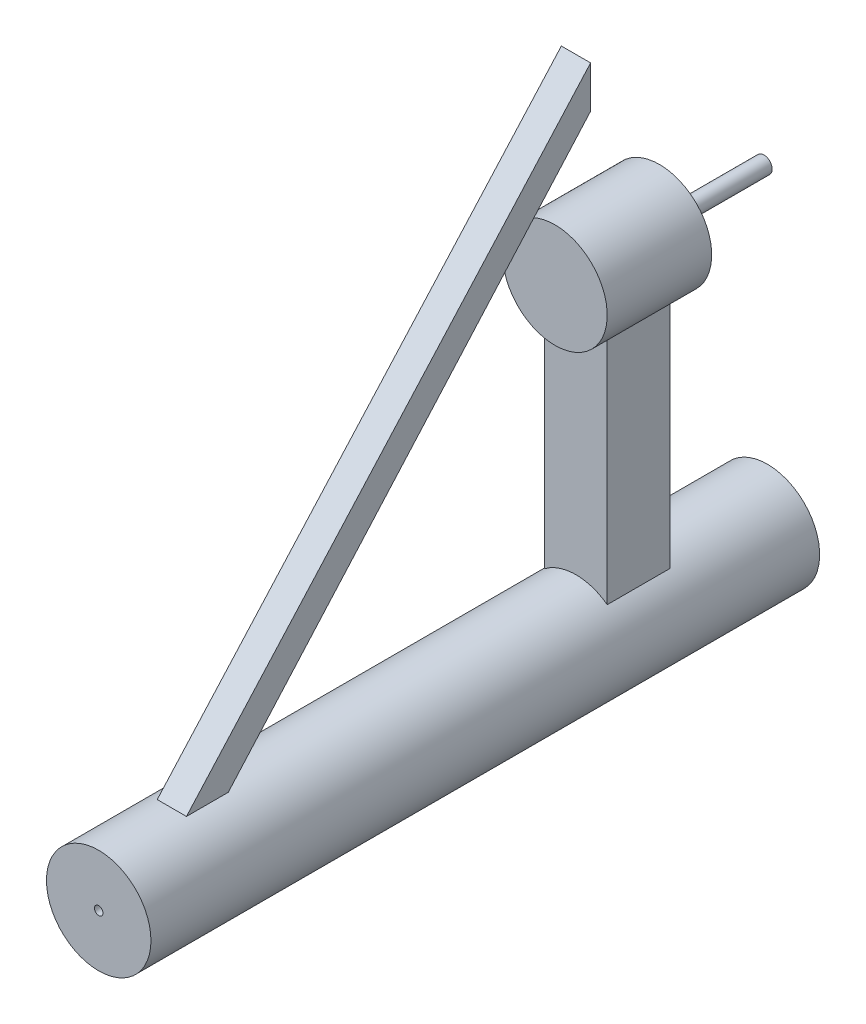
ISO-10303-21;
HEADER;
FILE_DESCRIPTION(('STEP AP214'),'2;1');
FILE_NAME('part.step','',(''),(''),'','','');
FILE_SCHEMA(('AUTOMOTIVE_DESIGN { 1 0 10303 214 1 1 1 1 }'));
ENDSEC;
DATA;
#1=APPLICATION_CONTEXT('core data for automotive mechanical design processes');
#2=APPLICATION_PROTOCOL_DEFINITION('international standard','automotive_design',2000,#1);
#3=PRODUCT_CONTEXT('',#1,'mechanical');
#4=PRODUCT('Part','Part','',(#3));
#5=PRODUCT_RELATED_PRODUCT_CATEGORY('part','',(#4));
#6=PRODUCT_DEFINITION_FORMATION('','',#4);
#7=PRODUCT_DEFINITION_CONTEXT('part definition',#1,'design');
#8=PRODUCT_DEFINITION('design','',#6,#7);
#9=PRODUCT_DEFINITION_SHAPE('','',#8);
#10=(LENGTH_UNIT() NAMED_UNIT(*) SI_UNIT(.MILLI.,.METRE.));
#11=(NAMED_UNIT(*) PLANE_ANGLE_UNIT() SI_UNIT($,.RADIAN.));
#12=(NAMED_UNIT(*) SI_UNIT($,.STERADIAN.) SOLID_ANGLE_UNIT());
#13=UNCERTAINTY_MEASURE_WITH_UNIT(LENGTH_MEASURE(1.E-05),#10,'distance_accuracy_value','');
#14=(GEOMETRIC_REPRESENTATION_CONTEXT(3) GLOBAL_UNCERTAINTY_ASSIGNED_CONTEXT((#13)) GLOBAL_UNIT_ASSIGNED_CONTEXT((#10,
#11,#12)) REPRESENTATION_CONTEXT('',''));
#15=CARTESIAN_POINT('',(0.,0.,0.));
#16=DIRECTION('',(0.,0.,1.));
#17=DIRECTION('',(1.,0.,0.));
#18=AXIS2_PLACEMENT_3D('',#15,#16,#17);
#19=CARTESIAN_POINT('',(-7.,25.,235.));
#20=DIRECTION('',(0.,-1.,0.));
#21=DIRECTION('',(0.,0.,-1.));
#22=AXIS2_PLACEMENT_3D('',#19,#20,#21);
#23=PLANE('',#22);
#24=DIRECTION('',(1.,0.,0.));
#25=VECTOR('',#24,1.);
#26=CARTESIAN_POINT('',(-7.,25.,215.));
#27=LINE('',#26,#25);
#28=CARTESIAN_POINT('',(-7.,25.,215.));
#29=VERTEX_POINT('',#28);
#30=CARTESIAN_POINT('',(7.,25.,215.));
#31=VERTEX_POINT('',#30);
#32=EDGE_CURVE('E57',#29,#31,#27,.T.);
#33=ORIENTED_EDGE('',*,*,#32,.T.);
#34=DIRECTION('',(0.,0.,-1.));
#35=VECTOR('',#34,1.);
#36=CARTESIAN_POINT('',(7.,25.,235.));
#37=LINE('',#36,#35);
#38=CARTESIAN_POINT('',(7.,25.,235.));
#39=VERTEX_POINT('',#38);
#40=EDGE_CURVE('E94',#39,#31,#37,.T.);
#41=ORIENTED_EDGE('',*,*,#40,.F.);
#42=DIRECTION('',(1.,0.,0.));
#43=VECTOR('',#42,1.);
#44=CARTESIAN_POINT('',(-7.,25.,235.));
#45=LINE('',#44,#43);
#46=CARTESIAN_POINT('',(-7.,25.,235.));
#47=VERTEX_POINT('',#46);
#48=EDGE_CURVE('E12',#47,#39,#45,.T.);
#49=ORIENTED_EDGE('',*,*,#48,.F.);
#50=DIRECTION('',(0.,0.,-1.));
#51=VECTOR('',#50,1.);
#52=CARTESIAN_POINT('',(-7.,25.,235.));
#53=LINE('',#52,#51);
#54=EDGE_CURVE('E95',#47,#29,#53,.T.);
#55=ORIENTED_EDGE('',*,*,#54,.T.);
#56=EDGE_LOOP('',(#33,#41,#49,#55));
#57=FACE_BOUND('',#56,.T.);
#58=ADVANCED_FACE('F54',(#57),#23,.T.);
#59=CARTESIAN_POINT('',(-7.,240.604607897903,41.6046078979033));
#60=DIRECTION('',(0.,0.667726277990492,0.744406889866667));
#61=DIRECTION('',(0.,-0.744406889866667,0.667726277990492));
#62=AXIS2_PLACEMENT_3D('',#59,#60,#61);
#63=PLANE('',#62);
#64=ORIENTED_EDGE('',*,*,#48,.T.);
#65=DIRECTION('',(0.,-0.744406889866667,0.667726277990492));
#66=VECTOR('',#65,1.);
#67=CARTESIAN_POINT('',(7.,240.604607897903,41.6046078979033));
#68=LINE('',#67,#66);
#69=CARTESIAN_POINT('',(7.,240.604607897903,41.6046078979033));
#70=VERTEX_POINT('',#69);
#71=EDGE_CURVE('E111',#70,#39,#68,.T.);
#72=ORIENTED_EDGE('',*,*,#71,.F.);
#73=DIRECTION('',(1.,0.,0.));
#74=VECTOR('',#73,1.);
#75=CARTESIAN_POINT('',(-7.,240.604607897903,41.6046078979033));
#76=LINE('',#75,#74);
#77=CARTESIAN_POINT('',(-7.,240.604607897903,41.6046078979033));
#78=VERTEX_POINT('',#77);
#79=EDGE_CURVE('E62',#78,#70,#76,.T.);
#80=ORIENTED_EDGE('',*,*,#79,.F.);
#81=DIRECTION('',(0.,-0.744406889866667,0.667726277990492));
#82=VECTOR('',#81,1.);
#83=CARTESIAN_POINT('',(-7.,240.604607897903,41.6046078979033));
#84=LINE('',#83,#82);
#85=EDGE_CURVE('E100',#78,#47,#84,.T.);
#86=ORIENTED_EDGE('',*,*,#85,.T.);
#87=EDGE_LOOP('',(#64,#72,#80,#86));
#88=FACE_BOUND('',#87,.T.);
#89=ADVANCED_FACE('F126',(#88),#63,.T.);
#90=CARTESIAN_POINT('',(-7.,240.604607897903,41.6046078979033));
#91=DIRECTION('',(0.,0.,-1.));
#92=DIRECTION('',(-1.,0.,0.));
#93=AXIS2_PLACEMENT_3D('',#90,#91,#92);
#94=PLANE('',#93);
#95=ORIENTED_EDGE('',*,*,#79,.T.);
#96=DIRECTION('',(0.,1.,0.));
#97=VECTOR('',#96,1.);
#98=CARTESIAN_POINT('',(7.,240.604607897903,41.6046078979033));
#99=LINE('',#98,#97);
#100=CARTESIAN_POINT('',(7.,220.604607897903,41.6046078979033));
#101=VERTEX_POINT('',#100);
#102=EDGE_CURVE('E107',#101,#70,#99,.T.);
#103=ORIENTED_EDGE('',*,*,#102,.F.);
#104=DIRECTION('',(1.,0.,0.));
#105=VECTOR('',#104,1.);
#106=CARTESIAN_POINT('',(-7.,220.604607897903,41.6046078979033));
#107=LINE('',#106,#105);
#108=CARTESIAN_POINT('',(-7.,220.604607897903,41.6046078979033));
#109=VERTEX_POINT('',#108);
#110=EDGE_CURVE('E99',#109,#101,#107,.T.);
#111=ORIENTED_EDGE('',*,*,#110,.F.);
#112=DIRECTION('',(0.,1.,0.));
#113=VECTOR('',#112,1.);
#114=CARTESIAN_POINT('',(-7.,240.604607897903,41.6046078979033));
#115=LINE('',#114,#113);
#116=EDGE_CURVE('E119',#109,#78,#115,.T.);
#117=ORIENTED_EDGE('',*,*,#116,.T.);
#118=EDGE_LOOP('',(#95,#103,#111,#117));
#119=FACE_BOUND('',#118,.T.);
#120=ADVANCED_FACE('F123',(#119),#94,.T.);
#121=CARTESIAN_POINT('',(-7.,220.604607897903,41.6046078979033));
#122=DIRECTION('',(0.,-0.663347321171446,-0.748311653988274));
#123=DIRECTION('',(0.,0.748311653988274,-0.663347321171446));
#124=AXIS2_PLACEMENT_3D('',#121,#122,#123);
#125=PLANE('',#124);
#126=ORIENTED_EDGE('',*,*,#110,.T.);
#127=DIRECTION('',(0.,0.748311653988274,-0.663347321171446));
#128=VECTOR('',#127,1.);
#129=CARTESIAN_POINT('',(7.,220.604607897903,41.6046078979033));
#130=LINE('',#129,#128);
#131=EDGE_CURVE('E102',#31,#101,#130,.T.);
#132=ORIENTED_EDGE('',*,*,#131,.F.);
#133=ORIENTED_EDGE('',*,*,#32,.F.);
#134=DIRECTION('',(0.,0.748311653988274,-0.663347321171446));
#135=VECTOR('',#134,1.);
#136=CARTESIAN_POINT('',(-7.,220.604607897903,41.6046078979033));
#137=LINE('',#136,#135);
#138=EDGE_CURVE('E117',#29,#109,#137,.T.);
#139=ORIENTED_EDGE('',*,*,#138,.T.);
#140=EDGE_LOOP('',(#126,#132,#133,#139));
#141=FACE_BOUND('',#140,.T.);
#142=ADVANCED_FACE('F103',(#141),#125,.T.);
#143=CARTESIAN_POINT('',(-7.,0.,0.));
#144=DIRECTION('',(-1.,0.,0.));
#145=DIRECTION('',(0.,0.,1.));
#146=AXIS2_PLACEMENT_3D('',#143,#144,#145);
#147=PLANE('',#146);
#148=ORIENTED_EDGE('',*,*,#54,.F.);
#149=ORIENTED_EDGE('',*,*,#85,.F.);
#150=ORIENTED_EDGE('',*,*,#116,.F.);
#151=ORIENTED_EDGE('',*,*,#138,.F.);
#152=EDGE_LOOP('',(#148,#149,#150,#151));
#153=FACE_BOUND('',#152,.T.);
#154=ADVANCED_FACE('F128',(#153),#147,.T.);
#155=CARTESIAN_POINT('',(7.,0.,0.));
#156=DIRECTION('',(-1.,0.,0.));
#157=DIRECTION('',(0.,0.,1.));
#158=AXIS2_PLACEMENT_3D('',#155,#156,#157);
#159=PLANE('',#158);
#160=ORIENTED_EDGE('',*,*,#40,.T.);
#161=ORIENTED_EDGE('',*,*,#131,.T.);
#162=ORIENTED_EDGE('',*,*,#102,.T.);
#163=ORIENTED_EDGE('',*,*,#71,.T.);
#164=EDGE_LOOP('',(#160,#161,#162,#163));
#165=FACE_BOUND('',#164,.T.);
#166=ADVANCED_FACE('F110',(#165),#159,.F.);
#167=CLOSED_SHELL('',(#58,#89,#120,#142,#154,#166));
#168=MANIFOLD_SOLID_BREP('B2_NOT_SHOWN',#167);
#169=CARTESIAN_POINT('',(0.,0.,270.));
#170=DIRECTION('',(0.,0.,-1.));
#171=DIRECTION('',(-1.,0.,0.));
#172=AXIS2_PLACEMENT_3D('',#169,#170,#171);
#173=CYLINDRICAL_SURFACE('',#172,25.);
#174=DIRECTION('',(0.,0.,-1.));
#175=VECTOR('',#174,1.);
#176=CARTESIAN_POINT('',(10.,-22.9128784747792,270.));
#177=LINE('',#176,#175);
#178=CARTESIAN_POINT('',(10.,-22.9128784747792,-14.1976960510484));
#179=VERTEX_POINT('',#178);
#180=CARTESIAN_POINT('',(10.,-22.9128784747792,-34.1976960510484));
#181=VERTEX_POINT('',#180);
#182=EDGE_CURVE('E52',#179,#181,#177,.T.);
#183=ORIENTED_EDGE('',*,*,#182,.T.);
#184=CARTESIAN_POINT('',(0.,0.,-34.1976960510484));
#185=DIRECTION('',(0.,0.,-1.));
#186=DIRECTION('',(-1.,0.,0.));
#187=AXIS2_PLACEMENT_3D('',#184,#185,#186);
#188=CIRCLE('',#187,25.);
#189=CARTESIAN_POINT('',(-9.99999999999999,-22.9128784747792,-34.1976960510484));
#190=VERTEX_POINT('',#189);
#191=EDGE_CURVE('E284',#181,#190,#188,.T.);
#192=ORIENTED_EDGE('',*,*,#191,.T.);
#193=DIRECTION('',(0.,0.,-1.));
#194=VECTOR('',#193,1.);
#195=CARTESIAN_POINT('',(-9.99999999999999,-22.9128784747792,270.));
#196=LINE('',#195,#194);
#197=CARTESIAN_POINT('',(-9.99999999999999,-22.9128784747792,-14.1976960510484));
#198=VERTEX_POINT('',#197);
#199=EDGE_CURVE('E184',#190,#198,#196,.F.);
#200=ORIENTED_EDGE('',*,*,#199,.T.);
#201=CARTESIAN_POINT('',(0.,0.,-14.1976960510484));
#202=DIRECTION('',(0.,0.,1.));
#203=DIRECTION('',(1.,0.,0.));
#204=AXIS2_PLACEMENT_3D('',#201,#202,#203);
#205=CIRCLE('',#204,25.);
#206=EDGE_CURVE('E332',#198,#179,#205,.T.);
#207=ORIENTED_EDGE('',*,*,#206,.T.);
#208=EDGE_LOOP('',(#183,#192,#200,#207));
#209=FACE_BOUND('',#208,.T.);
#210=CARTESIAN_POINT('',(0.,0.,270.));
#211=DIRECTION('',(0.,0.,1.));
#212=DIRECTION('',(1.,0.,0.));
#213=AXIS2_PLACEMENT_3D('',#210,#211,#212);
#214=CIRCLE('',#213,25.);
#215=CARTESIAN_POINT('',(25.,0.,270.));
#216=VERTEX_POINT('',#215);
#217=EDGE_CURVE('E315',#216,#216,#214,.T.);
#218=ORIENTED_EDGE('',*,*,#217,.F.);
#219=EDGE_LOOP('',(#218));
#220=FACE_BOUND('',#219,.T.);
#221=DIRECTION('',(0.,0.,-1.));
#222=VECTOR('',#221,1.);
#223=CARTESIAN_POINT('',(14.9500000000001,20.0374025262757,270.));
#224=LINE('',#223,#222);
#225=CARTESIAN_POINT('',(14.95,20.0374025262757,41.6046078979033));
#226=VERTEX_POINT('',#225);
#227=CARTESIAN_POINT('',(14.95,20.0374025262757,11.6046078979032));
#228=VERTEX_POINT('',#227);
#229=EDGE_CURVE('E327',#226,#228,#224,.T.);
#230=ORIENTED_EDGE('',*,*,#229,.F.);
#231=CARTESIAN_POINT('',(0.,0.,41.6046078979033));
#232=DIRECTION('',(0.,0.,-1.));
#233=DIRECTION('',(-1.,0.,0.));
#234=AXIS2_PLACEMENT_3D('',#231,#232,#233);
#235=CIRCLE('',#234,25.);
#236=CARTESIAN_POINT('',(-15.05,19.9624021600608,41.6046078979033));
#237=VERTEX_POINT('',#236);
#238=EDGE_CURVE('E318',#237,#226,#235,.T.);
#239=ORIENTED_EDGE('',*,*,#238,.F.);
#240=DIRECTION('',(0.,0.,-1.));
#241=VECTOR('',#240,1.);
#242=CARTESIAN_POINT('',(-15.05,19.9624021600608,270.));
#243=LINE('',#242,#241);
#244=CARTESIAN_POINT('',(-15.05,19.9624021600608,11.6046078979032));
#245=VERTEX_POINT('',#244);
#246=EDGE_CURVE('E321',#245,#237,#243,.F.);
#247=ORIENTED_EDGE('',*,*,#246,.F.);
#248=CARTESIAN_POINT('',(0.,0.,11.6046078979032));
#249=DIRECTION('',(0.,0.,1.));
#250=DIRECTION('',(1.,0.,0.));
#251=AXIS2_PLACEMENT_3D('',#248,#249,#250);
#252=CIRCLE('',#251,25.);
#253=EDGE_CURVE('E324',#228,#245,#252,.T.);
#254=ORIENTED_EDGE('',*,*,#253,.F.);
#255=EDGE_LOOP('',(#230,#239,#247,#254));
#256=FACE_BOUND('',#255,.T.);
#257=CARTESIAN_POINT('',(0.,0.,-50.));
#258=DIRECTION('',(0.,0.,-1.));
#259=DIRECTION('',(-1.,0.,0.));
#260=AXIS2_PLACEMENT_3D('',#257,#258,#259);
#261=CIRCLE('',#260,25.);
#262=CARTESIAN_POINT('',(-25.,0.,-50.));
#263=VERTEX_POINT('',#262);
#264=EDGE_CURVE('E288',#263,#263,#261,.T.);
#265=ORIENTED_EDGE('',*,*,#264,.F.);
#266=EDGE_LOOP('',(#265));
#267=FACE_BOUND('',#266,.T.);
#268=ADVANCED_FACE('F177',(#209,#220,#256,#267),#173,.T.);
#269=CARTESIAN_POINT('',(0.,0.,270.));
#270=DIRECTION('',(0.,0.,1.));
#271=DIRECTION('',(1.,0.,0.));
#272=AXIS2_PLACEMENT_3D('',#269,#270,#271);
#273=PLANE('',#272);
#274=CARTESIAN_POINT('',(0.,0.,270.));
#275=DIRECTION('',(0.,0.,1.));
#276=DIRECTION('',(1.,0.,0.));
#277=AXIS2_PLACEMENT_3D('',#274,#275,#276);
#278=CIRCLE('',#277,2.05);
#279=CARTESIAN_POINT('',(2.05,0.,270.));
#280=VERTEX_POINT('',#279);
#281=EDGE_CURVE('E267',#280,#280,#278,.T.);
#282=ORIENTED_EDGE('',*,*,#281,.F.);
#283=EDGE_LOOP('',(#282));
#284=FACE_BOUND('',#283,.T.);
#285=ORIENTED_EDGE('',*,*,#217,.T.);
#286=EDGE_LOOP('',(#285));
#287=FACE_BOUND('',#286,.T.);
#288=ADVANCED_FACE('F351',(#284,#287),#273,.T.);
#289=CARTESIAN_POINT('',(14.95,150.,11.6046078979033));
#290=DIRECTION('',(-1.,0.,0.));
#291=DIRECTION('',(0.,0.,1.));
#292=AXIS2_PLACEMENT_3D('',#289,#290,#291);
#293=PLANE('',#292);
#294=DIRECTION('',(0.,-1.,0.));
#295=VECTOR('',#294,1.);
#296=CARTESIAN_POINT('',(14.95,150.,11.6046078979033));
#297=LINE('',#296,#295);
#298=CARTESIAN_POINT('',(14.95,130.,11.6046078979033));
#299=VERTEX_POINT('',#298);
#300=EDGE_CURVE('E313',#299,#228,#297,.T.);
#301=ORIENTED_EDGE('',*,*,#300,.F.);
#302=DIRECTION('',(0.,0.,-1.));
#303=VECTOR('',#302,1.);
#304=CARTESIAN_POINT('',(14.95,130.,51.6046078979032));
#305=LINE('',#304,#303);
#306=CARTESIAN_POINT('',(14.95,130.,41.6046078979033));
#307=VERTEX_POINT('',#306);
#308=EDGE_CURVE('E301',#299,#307,#305,.F.);
#309=ORIENTED_EDGE('',*,*,#308,.T.);
#310=DIRECTION('',(0.,-1.,0.));
#311=VECTOR('',#310,1.);
#312=CARTESIAN_POINT('',(14.95,150.,41.6046078979033));
#313=LINE('',#312,#311);
#314=EDGE_CURVE('E307',#307,#226,#313,.T.);
#315=ORIENTED_EDGE('',*,*,#314,.T.);
#316=ORIENTED_EDGE('',*,*,#229,.T.);
#317=EDGE_LOOP('',(#301,#309,#315,#316));
#318=FACE_BOUND('',#317,.T.);
#319=ADVANCED_FACE('F356',(#318),#293,.F.);
#320=CARTESIAN_POINT('',(-15.05,150.,11.6046078979033));
#321=DIRECTION('',(1.,0.,0.));
#322=DIRECTION('',(0.,0.,-1.));
#323=AXIS2_PLACEMENT_3D('',#320,#321,#322);
#324=PLANE('',#323);
#325=DIRECTION('',(0.,-1.,0.));
#326=VECTOR('',#325,1.);
#327=CARTESIAN_POINT('',(-15.05,150.,41.6046078979033));
#328=LINE('',#327,#326);
#329=CARTESIAN_POINT('',(-15.05,130.,41.6046078979033));
#330=VERTEX_POINT('',#329);
#331=EDGE_CURVE('E309',#330,#237,#328,.T.);
#332=ORIENTED_EDGE('',*,*,#331,.F.);
#333=DIRECTION('',(0.,0.,-1.));
#334=VECTOR('',#333,1.);
#335=CARTESIAN_POINT('',(-15.05,130.,51.6046078979032));
#336=LINE('',#335,#334);
#337=CARTESIAN_POINT('',(-15.05,130.,11.6046078979033));
#338=VERTEX_POINT('',#337);
#339=EDGE_CURVE('E199',#330,#338,#336,.T.);
#340=ORIENTED_EDGE('',*,*,#339,.T.);
#341=DIRECTION('',(0.,-1.,0.));
#342=VECTOR('',#341,1.);
#343=CARTESIAN_POINT('',(-15.05,150.,11.6046078979033));
#344=LINE('',#343,#342);
#345=EDGE_CURVE('E311',#338,#245,#344,.T.);
#346=ORIENTED_EDGE('',*,*,#345,.T.);
#347=ORIENTED_EDGE('',*,*,#246,.T.);
#348=EDGE_LOOP('',(#332,#340,#346,#347));
#349=FACE_BOUND('',#348,.T.);
#350=ADVANCED_FACE('F363',(#349),#324,.F.);
#351=CARTESIAN_POINT('',(-15.05,150.,11.6046078979033));
#352=DIRECTION('',(0.,0.,1.));
#353=DIRECTION('',(1.,0.,0.));
#354=AXIS2_PLACEMENT_3D('',#351,#352,#353);
#355=PLANE('',#354);
#356=ORIENTED_EDGE('',*,*,#345,.F.);
#357=CARTESIAN_POINT('',(-0.0499999999999997,150.,11.6046078979033));
#358=DIRECTION('',(0.,0.,1.));
#359=DIRECTION('',(1.,0.,0.));
#360=AXIS2_PLACEMENT_3D('',#357,#358,#359);
#361=CIRCLE('',#360,25.);
#362=EDGE_CURVE('E304',#338,#299,#361,.T.);
#363=ORIENTED_EDGE('',*,*,#362,.T.);
#364=ORIENTED_EDGE('',*,*,#300,.T.);
#365=ORIENTED_EDGE('',*,*,#253,.T.);
#366=EDGE_LOOP('',(#356,#363,#364,#365));
#367=FACE_BOUND('',#366,.T.);
#368=ADVANCED_FACE('F369',(#367),#355,.F.);
#369=CARTESIAN_POINT('',(-15.05,150.,41.6046078979033));
#370=DIRECTION('',(0.,0.,-1.));
#371=DIRECTION('',(-1.,0.,0.));
#372=AXIS2_PLACEMENT_3D('',#369,#370,#371);
#373=PLANE('',#372);
#374=ORIENTED_EDGE('',*,*,#314,.F.);
#375=CARTESIAN_POINT('',(-0.0499999999999997,150.,41.6046078979033));
#376=DIRECTION('',(0.,0.,-1.));
#377=DIRECTION('',(-1.,0.,0.));
#378=AXIS2_PLACEMENT_3D('',#375,#376,#377);
#379=CIRCLE('',#378,25.);
#380=EDGE_CURVE('E291',#307,#330,#379,.T.);
#381=ORIENTED_EDGE('',*,*,#380,.T.);
#382=ORIENTED_EDGE('',*,*,#331,.T.);
#383=ORIENTED_EDGE('',*,*,#238,.T.);
#384=EDGE_LOOP('',(#374,#381,#382,#383));
#385=FACE_BOUND('',#384,.T.);
#386=ADVANCED_FACE('F372',(#385),#373,.F.);
#387=CARTESIAN_POINT('',(-0.0499999999999997,150.,51.6046078979032));
#388=DIRECTION('',(0.,0.,-1.));
#389=DIRECTION('',(-1.,0.,0.));
#390=AXIS2_PLACEMENT_3D('',#387,#388,#389);
#391=CYLINDRICAL_SURFACE('',#390,25.);
#392=CARTESIAN_POINT('',(-0.0499999999999997,150.,1.60460789790325));
#393=DIRECTION('',(0.,0.,-1.));
#394=DIRECTION('',(-1.,0.,0.));
#395=AXIS2_PLACEMENT_3D('',#392,#393,#394);
#396=CIRCLE('',#395,25.);
#397=CARTESIAN_POINT('',(-25.05,150.,1.60460789790325));
#398=VERTEX_POINT('',#397);
#399=EDGE_CURVE('E294',#398,#398,#396,.T.);
#400=ORIENTED_EDGE('',*,*,#399,.F.);
#401=EDGE_LOOP('',(#400));
#402=FACE_BOUND('',#401,.T.);
#403=CARTESIAN_POINT('',(-0.0499999999999997,150.,51.6046078979032));
#404=DIRECTION('',(0.,0.,-1.));
#405=DIRECTION('',(-1.,0.,0.));
#406=AXIS2_PLACEMENT_3D('',#403,#404,#405);
#407=CIRCLE('',#406,25.);
#408=CARTESIAN_POINT('',(-25.05,150.,51.6046078979032));
#409=VERTEX_POINT('',#408);
#410=EDGE_CURVE('E297',#409,#409,#407,.T.);
#411=ORIENTED_EDGE('',*,*,#410,.T.);
#412=EDGE_LOOP('',(#411));
#413=FACE_BOUND('',#412,.T.);
#414=ORIENTED_EDGE('',*,*,#362,.F.);
#415=ORIENTED_EDGE('',*,*,#339,.F.);
#416=ORIENTED_EDGE('',*,*,#380,.F.);
#417=ORIENTED_EDGE('',*,*,#308,.F.);
#418=EDGE_LOOP('',(#414,#415,#416,#417));
#419=FACE_BOUND('',#418,.T.);
#420=ADVANCED_FACE('F379',(#402,#413,#419),#391,.T.);
#421=CARTESIAN_POINT('',(-0.0499999999999997,150.,51.6046078979032));
#422=DIRECTION('',(0.,0.,-1.));
#423=DIRECTION('',(-1.,0.,0.));
#424=AXIS2_PLACEMENT_3D('',#421,#422,#423);
#425=PLANE('',#424);
#426=ORIENTED_EDGE('',*,*,#410,.F.);
#427=EDGE_LOOP('',(#426));
#428=FACE_BOUND('',#427,.T.);
#429=ADVANCED_FACE('F383',(#428),#425,.F.);
#430=CARTESIAN_POINT('',(-0.0499999999999997,150.,1.60460789790325));
#431=DIRECTION('',(0.,0.,-1.));
#432=DIRECTION('',(-1.,0.,0.));
#433=AXIS2_PLACEMENT_3D('',#430,#431,#432);
#434=PLANE('',#433);
#435=CARTESIAN_POINT('',(-0.0499999999999997,150.,1.60460789790325));
#436=DIRECTION('',(0.,0.,-1.));
#437=DIRECTION('',(-1.,0.,0.));
#438=AXIS2_PLACEMENT_3D('',#435,#436,#437);
#439=CIRCLE('',#438,3.95);
#440=CARTESIAN_POINT('',(-4.,150.,1.60460789790325));
#441=VERTEX_POINT('',#440);
#442=EDGE_CURVE('E285',#441,#441,#439,.T.);
#443=ORIENTED_EDGE('',*,*,#442,.F.);
#444=EDGE_LOOP('',(#443));
#445=FACE_BOUND('',#444,.T.);
#446=ORIENTED_EDGE('',*,*,#399,.T.);
#447=EDGE_LOOP('',(#446));
#448=FACE_BOUND('',#447,.T.);
#449=ADVANCED_FACE('F387',(#445,#448),#434,.T.);
#450=CARTESIAN_POINT('',(0.,0.,-50.));
#451=DIRECTION('',(0.,0.,-1.));
#452=DIRECTION('',(-1.,0.,0.));
#453=AXIS2_PLACEMENT_3D('',#450,#451,#452);
#454=PLANE('',#453);
#455=CARTESIAN_POINT('',(0.,0.,-50.));
#456=DIRECTION('',(0.,0.,-1.));
#457=DIRECTION('',(-1.,0.,0.));
#458=AXIS2_PLACEMENT_3D('',#455,#456,#457);
#459=CIRCLE('',#458,3.95);
#460=CARTESIAN_POINT('',(-3.95,0.,-50.));
#461=VERTEX_POINT('',#460);
#462=EDGE_CURVE('E281',#461,#461,#459,.T.);
#463=ORIENTED_EDGE('',*,*,#462,.F.);
#464=EDGE_LOOP('',(#463));
#465=FACE_BOUND('',#464,.T.);
#466=ORIENTED_EDGE('',*,*,#264,.T.);
#467=EDGE_LOOP('',(#466));
#468=FACE_BOUND('',#467,.T.);
#469=ADVANCED_FACE('F391',(#465,#468),#454,.T.);
#470=CARTESIAN_POINT('',(-0.0499999999999997,150.,-48.3953921020967));
#471=DIRECTION('',(0.,0.,1.));
#472=DIRECTION('',(1.,0.,0.));
#473=AXIS2_PLACEMENT_3D('',#470,#471,#472);
#474=CYLINDRICAL_SURFACE('',#473,3.95);
#475=CARTESIAN_POINT('',(-0.0499999999999997,150.,-48.3953921020967));
#476=DIRECTION('',(0.,0.,-1.));
#477=DIRECTION('',(-1.,0.,0.));
#478=AXIS2_PLACEMENT_3D('',#475,#476,#477);
#479=CIRCLE('',#478,3.95);
#480=CARTESIAN_POINT('',(-4.,150.,-48.3953921020967));
#481=VERTEX_POINT('',#480);
#482=EDGE_CURVE('E280',#481,#481,#479,.T.);
#483=ORIENTED_EDGE('',*,*,#482,.F.);
#484=EDGE_LOOP('',(#483));
#485=FACE_BOUND('',#484,.T.);
#486=ORIENTED_EDGE('',*,*,#442,.T.);
#487=EDGE_LOOP('',(#486));
#488=FACE_BOUND('',#487,.T.);
#489=ADVANCED_FACE('F395',(#485,#488),#474,.T.);
#490=CARTESIAN_POINT('',(-0.0499999999999997,150.,-48.3953921020967));
#491=DIRECTION('',(0.,0.,-1.));
#492=DIRECTION('',(-1.,0.,0.));
#493=AXIS2_PLACEMENT_3D('',#490,#491,#492);
#494=PLANE('',#493);
#495=ORIENTED_EDGE('',*,*,#482,.T.);
#496=EDGE_LOOP('',(#495));
#497=FACE_BOUND('',#496,.T.);
#498=ADVANCED_FACE('F399',(#497),#494,.T.);
#499=CARTESIAN_POINT('',(0.,0.,-56.));
#500=DIRECTION('',(0.,0.,1.));
#501=DIRECTION('',(1.,0.,0.));
#502=AXIS2_PLACEMENT_3D('',#499,#500,#501);
#503=CYLINDRICAL_SURFACE('',#502,3.95);
#504=CARTESIAN_POINT('',(0.,0.,-56.));
#505=DIRECTION('',(0.,0.,-1.));
#506=DIRECTION('',(-1.,0.,0.));
#507=AXIS2_PLACEMENT_3D('',#504,#505,#506);
#508=CIRCLE('',#507,3.95);
#509=CARTESIAN_POINT('',(-3.95,0.,-56.));
#510=VERTEX_POINT('',#509);
#511=EDGE_CURVE('E275',#510,#510,#508,.T.);
#512=ORIENTED_EDGE('',*,*,#511,.F.);
#513=EDGE_LOOP('',(#512));
#514=FACE_BOUND('',#513,.T.);
#515=ORIENTED_EDGE('',*,*,#462,.T.);
#516=EDGE_LOOP('',(#515));
#517=FACE_BOUND('',#516,.T.);
#518=ADVANCED_FACE('F403',(#514,#517),#503,.T.);
#519=CARTESIAN_POINT('',(0.,0.,-56.));
#520=DIRECTION('',(0.,0.,-1.));
#521=DIRECTION('',(-1.,0.,0.));
#522=AXIS2_PLACEMENT_3D('',#519,#520,#521);
#523=PLANE('',#522);
#524=ORIENTED_EDGE('',*,*,#511,.T.);
#525=EDGE_LOOP('',(#524));
#526=FACE_BOUND('',#525,.T.);
#527=ADVANCED_FACE('F407',(#526),#523,.T.);
#528=CARTESIAN_POINT('',(0.,0.,260.));
#529=DIRECTION('',(0.,0.,1.));
#530=DIRECTION('',(1.,0.,0.));
#531=AXIS2_PLACEMENT_3D('',#528,#529,#530);
#532=CYLINDRICAL_SURFACE('',#531,2.05);
#533=CARTESIAN_POINT('',(0.,0.,260.));
#534=DIRECTION('',(0.,0.,1.));
#535=DIRECTION('',(1.,0.,0.));
#536=AXIS2_PLACEMENT_3D('',#533,#534,#535);
#537=CIRCLE('',#536,2.05);
#538=CARTESIAN_POINT('',(2.05,0.,260.));
#539=VERTEX_POINT('',#538);
#540=EDGE_CURVE('E272',#539,#539,#537,.T.);
#541=ORIENTED_EDGE('',*,*,#540,.F.);
#542=EDGE_LOOP('',(#541));
#543=FACE_BOUND('',#542,.T.);
#544=ORIENTED_EDGE('',*,*,#281,.T.);
#545=EDGE_LOOP('',(#544));
#546=FACE_BOUND('',#545,.T.);
#547=ADVANCED_FACE('F410',(#543,#546),#532,.F.);
#548=CARTESIAN_POINT('',(0.,0.,260.));
#549=DIRECTION('',(0.,0.,1.));
#550=DIRECTION('',(1.,0.,0.));
#551=AXIS2_PLACEMENT_3D('',#548,#549,#550);
#552=PLANE('',#551);
#553=ORIENTED_EDGE('',*,*,#540,.T.);
#554=EDGE_LOOP('',(#553));
#555=FACE_BOUND('',#554,.T.);
#556=ADVANCED_FACE('F347',(#555),#552,.T.);
#557=CARTESIAN_POINT('',(-9.99999999999999,-5.,-14.1976960510484));
#558=DIRECTION('',(-1.,0.,0.));
#559=DIRECTION('',(0.,0.,1.));
#560=AXIS2_PLACEMENT_3D('',#557,#558,#559);
#561=PLANE('',#560);
#562=DIRECTION('',(0.,-1.,0.));
#563=VECTOR('',#562,1.);
#564=CARTESIAN_POINT('',(-9.99999999999999,-5.,-34.1976960510484));
#565=LINE('',#564,#563);
#566=CARTESIAN_POINT('',(-9.99999999999999,-5.,-34.1976960510484));
#567=VERTEX_POINT('',#566);
#568=EDGE_CURVE('E191',#567,#190,#565,.T.);
#569=ORIENTED_EDGE('',*,*,#568,.F.);
#570=DIRECTION('',(0.,0.,-1.));
#571=VECTOR('',#570,1.);
#572=CARTESIAN_POINT('',(-9.99999999999999,-5.,-14.1976960510484));
#573=LINE('',#572,#571);
#574=CARTESIAN_POINT('',(-9.99999999999999,-5.,-14.1976960510484));
#575=VERTEX_POINT('',#574);
#576=EDGE_CURVE('E243',#575,#567,#573,.T.);
#577=ORIENTED_EDGE('',*,*,#576,.F.);
#578=DIRECTION('',(0.,-1.,0.));
#579=VECTOR('',#578,1.);
#580=CARTESIAN_POINT('',(-9.99999999999999,-5.,-14.1976960510484));
#581=LINE('',#580,#579);
#582=EDGE_CURVE('E265',#575,#198,#581,.T.);
#583=ORIENTED_EDGE('',*,*,#582,.T.);
#584=ORIENTED_EDGE('',*,*,#199,.F.);
#585=EDGE_LOOP('',(#569,#577,#583,#584));
#586=FACE_BOUND('',#585,.T.);
#587=ADVANCED_FACE('F240',(#586),#561,.F.);
#588=CARTESIAN_POINT('',(10.,-5.,-14.1976960510484));
#589=DIRECTION('',(0.,0.,1.));
#590=DIRECTION('',(1.,0.,0.));
#591=AXIS2_PLACEMENT_3D('',#588,#589,#590);
#592=PLANE('',#591);
#593=ORIENTED_EDGE('',*,*,#582,.F.);
#594=DIRECTION('',(-1.,0.,0.));
#595=VECTOR('',#594,1.);
#596=CARTESIAN_POINT('',(10.,-5.,-14.1976960510484));
#597=LINE('',#596,#595);
#598=CARTESIAN_POINT('',(10.,-5.,-14.1976960510484));
#599=VERTEX_POINT('',#598);
#600=EDGE_CURVE('E248',#599,#575,#597,.T.);
#601=ORIENTED_EDGE('',*,*,#600,.F.);
#602=DIRECTION('',(0.,-1.,0.));
#603=VECTOR('',#602,1.);
#604=CARTESIAN_POINT('',(10.,-5.,-14.1976960510484));
#605=LINE('',#604,#603);
#606=EDGE_CURVE('E268',#599,#179,#605,.T.);
#607=ORIENTED_EDGE('',*,*,#606,.T.);
#608=ORIENTED_EDGE('',*,*,#206,.F.);
#609=EDGE_LOOP('',(#593,#601,#607,#608));
#610=FACE_BOUND('',#609,.T.);
#611=ADVANCED_FACE('F339',(#610),#592,.F.);
#612=CARTESIAN_POINT('',(10.,-5.,-14.1976960510484));
#613=DIRECTION('',(1.,0.,0.));
#614=DIRECTION('',(0.,0.,-1.));
#615=AXIS2_PLACEMENT_3D('',#612,#613,#614);
#616=PLANE('',#615);
#617=ORIENTED_EDGE('',*,*,#606,.F.);
#618=DIRECTION('',(0.,0.,1.));
#619=VECTOR('',#618,1.);
#620=CARTESIAN_POINT('',(10.,-5.,-14.1976960510484));
#621=LINE('',#620,#619);
#622=CARTESIAN_POINT('',(10.,-5.,-34.1976960510484));
#623=VERTEX_POINT('',#622);
#624=EDGE_CURVE('E257',#623,#599,#621,.T.);
#625=ORIENTED_EDGE('',*,*,#624,.F.);
#626=DIRECTION('',(0.,-1.,0.));
#627=VECTOR('',#626,1.);
#628=CARTESIAN_POINT('',(10.,-5.,-34.1976960510484));
#629=LINE('',#628,#627);
#630=EDGE_CURVE('E247',#623,#181,#629,.T.);
#631=ORIENTED_EDGE('',*,*,#630,.T.);
#632=ORIENTED_EDGE('',*,*,#182,.F.);
#633=EDGE_LOOP('',(#617,#625,#631,#632));
#634=FACE_BOUND('',#633,.T.);
#635=ADVANCED_FACE('F337',(#634),#616,.F.);
#636=CARTESIAN_POINT('',(10.,-5.,-34.1976960510484));
#637=DIRECTION('',(0.,0.,-1.));
#638=DIRECTION('',(-1.,0.,0.));
#639=AXIS2_PLACEMENT_3D('',#636,#637,#638);
#640=PLANE('',#639);
#641=ORIENTED_EDGE('',*,*,#630,.F.);
#642=DIRECTION('',(1.,0.,0.));
#643=VECTOR('',#642,1.);
#644=CARTESIAN_POINT('',(10.,-5.,-34.1976960510484));
#645=LINE('',#644,#643);
#646=EDGE_CURVE('E251',#567,#623,#645,.T.);
#647=ORIENTED_EDGE('',*,*,#646,.F.);
#648=ORIENTED_EDGE('',*,*,#568,.T.);
#649=ORIENTED_EDGE('',*,*,#191,.F.);
#650=EDGE_LOOP('',(#641,#647,#648,#649));
#651=FACE_BOUND('',#650,.T.);
#652=ADVANCED_FACE('F252',(#651),#640,.F.);
#653=CARTESIAN_POINT('',(0.,-5.,0.));
#654=DIRECTION('',(0.,1.,0.));
#655=DIRECTION('',(0.,0.,1.));
#656=AXIS2_PLACEMENT_3D('',#653,#654,#655);
#657=PLANE('',#656);
#658=ORIENTED_EDGE('',*,*,#576,.T.);
#659=ORIENTED_EDGE('',*,*,#646,.T.);
#660=ORIENTED_EDGE('',*,*,#624,.T.);
#661=ORIENTED_EDGE('',*,*,#600,.T.);
#662=EDGE_LOOP('',(#658,#659,#660,#661));
#663=FACE_BOUND('',#662,.T.);
#664=ADVANCED_FACE('F259',(#663),#657,.F.);
#665=CLOSED_SHELL('',(#268,#288,#319,#350,#368,#386,#420,#429,#449,#469,#489,#498,#518,#527,
#547,#556,#587,#611,#635,#652,#664));
#666=MANIFOLD_SOLID_BREP('B6',#665);
#667=ADVANCED_BREP_SHAPE_REPRESENTATION('',(#18,#168,#666),#14);
#668=SHAPE_DEFINITION_REPRESENTATION(#9,#667);
ENDSEC;
END-ISO-10303-21;
